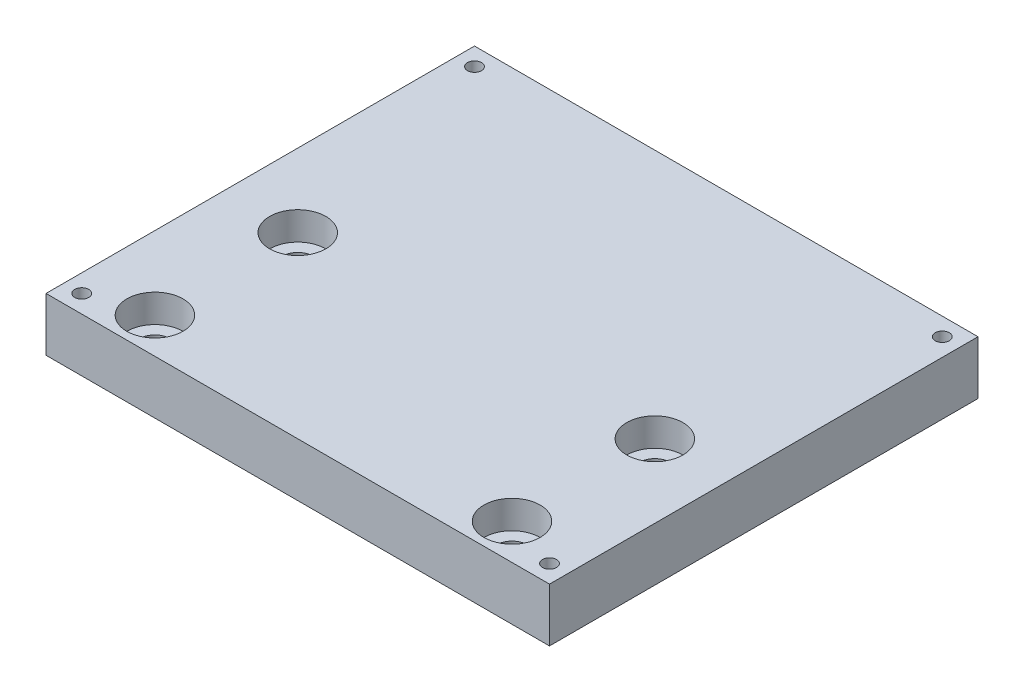
ISO-10303-21;
HEADER;
FILE_DESCRIPTION(('STEP AP214'),'2;1');
FILE_NAME('part.step','',(''),(''),'','','');
FILE_SCHEMA(('AUTOMOTIVE_DESIGN { 1 0 10303 214 1 1 1 1 }'));
ENDSEC;
DATA;
#1=APPLICATION_CONTEXT('core data for automotive mechanical design processes');
#2=APPLICATION_PROTOCOL_DEFINITION('international standard','automotive_design',2000,#1);
#3=PRODUCT_CONTEXT('',#1,'mechanical');
#4=PRODUCT('Part','Part','',(#3));
#5=PRODUCT_RELATED_PRODUCT_CATEGORY('part','',(#4));
#6=PRODUCT_DEFINITION_FORMATION('','',#4);
#7=PRODUCT_DEFINITION_CONTEXT('part definition',#1,'design');
#8=PRODUCT_DEFINITION('design','',#6,#7);
#9=PRODUCT_DEFINITION_SHAPE('','',#8);
#10=(LENGTH_UNIT() NAMED_UNIT(*) SI_UNIT(.MILLI.,.METRE.));
#11=(NAMED_UNIT(*) PLANE_ANGLE_UNIT() SI_UNIT($,.RADIAN.));
#12=(NAMED_UNIT(*) SI_UNIT($,.STERADIAN.) SOLID_ANGLE_UNIT());
#13=UNCERTAINTY_MEASURE_WITH_UNIT(LENGTH_MEASURE(1.E-05),#10,'distance_accuracy_value','');
#14=(GEOMETRIC_REPRESENTATION_CONTEXT(3) GLOBAL_UNCERTAINTY_ASSIGNED_CONTEXT((#13)) GLOBAL_UNIT_ASSIGNED_CONTEXT((#10,
#11,#12)) REPRESENTATION_CONTEXT('',''));
#15=CARTESIAN_POINT('',(0.,0.,0.));
#16=DIRECTION('',(0.,0.,1.));
#17=DIRECTION('',(1.,0.,0.));
#18=AXIS2_PLACEMENT_3D('',#15,#16,#17);
#19=CARTESIAN_POINT('',(44.7675,9.525,38.1));
#20=DIRECTION('',(-1.,0.,0.));
#21=DIRECTION('',(0.,0.,1.));
#22=AXIS2_PLACEMENT_3D('',#19,#20,#21);
#23=PLANE('',#22);
#24=DIRECTION('',(0.,0.,-1.));
#25=VECTOR('',#24,1.);
#26=CARTESIAN_POINT('',(44.7675,0.,38.1));
#27=LINE('',#26,#25);
#28=CARTESIAN_POINT('',(44.7675,0.,38.1));
#29=VERTEX_POINT('',#28);
#30=CARTESIAN_POINT('',(44.7675,0.,-38.1));
#31=VERTEX_POINT('',#30);
#32=EDGE_CURVE('E94',#29,#31,#27,.T.);
#33=ORIENTED_EDGE('',*,*,#32,.T.);
#34=DIRECTION('',(0.,-1.,0.));
#35=VECTOR('',#34,1.);
#36=CARTESIAN_POINT('',(44.7675,9.525,-38.1));
#37=LINE('',#36,#35);
#38=CARTESIAN_POINT('',(44.7675,9.525,-38.1));
#39=VERTEX_POINT('',#38);
#40=EDGE_CURVE('E11',#39,#31,#37,.T.);
#41=ORIENTED_EDGE('',*,*,#40,.F.);
#42=DIRECTION('',(0.,0.,-1.));
#43=VECTOR('',#42,1.);
#44=CARTESIAN_POINT('',(44.7675,9.525,38.1));
#45=LINE('',#44,#43);
#46=CARTESIAN_POINT('',(44.7675,9.525,38.1));
#47=VERTEX_POINT('',#46);
#48=EDGE_CURVE('E82',#47,#39,#45,.T.);
#49=ORIENTED_EDGE('',*,*,#48,.F.);
#50=DIRECTION('',(0.,-1.,0.));
#51=VECTOR('',#50,1.);
#52=CARTESIAN_POINT('',(44.7675,9.525,38.1));
#53=LINE('',#52,#51);
#54=EDGE_CURVE('E90',#47,#29,#53,.T.);
#55=ORIENTED_EDGE('',*,*,#54,.T.);
#56=EDGE_LOOP('',(#33,#41,#49,#55));
#57=FACE_BOUND('',#56,.T.);
#58=ADVANCED_FACE('F31',(#57),#23,.F.);
#59=CARTESIAN_POINT('',(-44.7675,9.525,-38.1));
#60=DIRECTION('',(0.,0.,1.));
#61=DIRECTION('',(1.,0.,0.));
#62=AXIS2_PLACEMENT_3D('',#59,#60,#61);
#63=PLANE('',#62);
#64=DIRECTION('',(-1.,0.,0.));
#65=VECTOR('',#64,1.);
#66=CARTESIAN_POINT('',(-44.7675,0.,-38.1));
#67=LINE('',#66,#65);
#68=CARTESIAN_POINT('',(-44.7675,0.,-38.1));
#69=VERTEX_POINT('',#68);
#70=EDGE_CURVE('E86',#31,#69,#67,.T.);
#71=ORIENTED_EDGE('',*,*,#70,.T.);
#72=DIRECTION('',(0.,-1.,0.));
#73=VECTOR('',#72,1.);
#74=CARTESIAN_POINT('',(-44.7675,9.525,-38.1));
#75=LINE('',#74,#73);
#76=CARTESIAN_POINT('',(-44.7675,9.525,-38.1));
#77=VERTEX_POINT('',#76);
#78=EDGE_CURVE('E39',#77,#69,#75,.T.);
#79=ORIENTED_EDGE('',*,*,#78,.F.);
#80=DIRECTION('',(-1.,0.,0.));
#81=VECTOR('',#80,1.);
#82=CARTESIAN_POINT('',(-44.7675,9.525,-38.1));
#83=LINE('',#82,#81);
#84=EDGE_CURVE('E77',#39,#77,#83,.T.);
#85=ORIENTED_EDGE('',*,*,#84,.F.);
#86=ORIENTED_EDGE('',*,*,#40,.T.);
#87=EDGE_LOOP('',(#71,#79,#85,#86));
#88=FACE_BOUND('',#87,.T.);
#89=ADVANCED_FACE('F85',(#88),#63,.F.);
#90=CARTESIAN_POINT('',(-44.7675,9.525,38.1));
#91=DIRECTION('',(1.,0.,0.));
#92=DIRECTION('',(0.,0.,-1.));
#93=AXIS2_PLACEMENT_3D('',#90,#91,#92);
#94=PLANE('',#93);
#95=DIRECTION('',(0.,0.,1.));
#96=VECTOR('',#95,1.);
#97=CARTESIAN_POINT('',(-44.7675,0.,38.1));
#98=LINE('',#97,#96);
#99=CARTESIAN_POINT('',(-44.7675,0.,38.1));
#100=VERTEX_POINT('',#99);
#101=EDGE_CURVE('E64',#69,#100,#98,.T.);
#102=ORIENTED_EDGE('',*,*,#101,.T.);
#103=DIRECTION('',(0.,-1.,0.));
#104=VECTOR('',#103,1.);
#105=CARTESIAN_POINT('',(-44.7675,9.525,38.1));
#106=LINE('',#105,#104);
#107=CARTESIAN_POINT('',(-44.7675,9.525,38.1));
#108=VERTEX_POINT('',#107);
#109=EDGE_CURVE('E87',#108,#100,#106,.T.);
#110=ORIENTED_EDGE('',*,*,#109,.F.);
#111=DIRECTION('',(0.,0.,1.));
#112=VECTOR('',#111,1.);
#113=CARTESIAN_POINT('',(-44.7675,9.525,38.1));
#114=LINE('',#113,#112);
#115=EDGE_CURVE('E80',#77,#108,#114,.T.);
#116=ORIENTED_EDGE('',*,*,#115,.F.);
#117=ORIENTED_EDGE('',*,*,#78,.T.);
#118=EDGE_LOOP('',(#102,#110,#116,#117));
#119=FACE_BOUND('',#118,.T.);
#120=ADVANCED_FACE('F88',(#119),#94,.F.);
#121=CARTESIAN_POINT('',(-44.7675,9.525,38.1));
#122=DIRECTION('',(0.,0.,-1.));
#123=DIRECTION('',(-1.,0.,0.));
#124=AXIS2_PLACEMENT_3D('',#121,#122,#123);
#125=PLANE('',#124);
#126=DIRECTION('',(1.,0.,0.));
#127=VECTOR('',#126,1.);
#128=CARTESIAN_POINT('',(-44.7675,0.,38.1));
#129=LINE('',#128,#127);
#130=EDGE_CURVE('E70',#100,#29,#129,.T.);
#131=ORIENTED_EDGE('',*,*,#130,.T.);
#132=ORIENTED_EDGE('',*,*,#54,.F.);
#133=DIRECTION('',(1.,0.,0.));
#134=VECTOR('',#133,1.);
#135=CARTESIAN_POINT('',(-44.7675,9.525,38.1));
#136=LINE('',#135,#134);
#137=EDGE_CURVE('E47',#108,#47,#136,.T.);
#138=ORIENTED_EDGE('',*,*,#137,.F.);
#139=ORIENTED_EDGE('',*,*,#109,.T.);
#140=EDGE_LOOP('',(#131,#132,#138,#139));
#141=FACE_BOUND('',#140,.T.);
#142=ADVANCED_FACE('F102',(#141),#125,.F.);
#143=CARTESIAN_POINT('',(44.7675,9.525,-38.1));
#144=DIRECTION('',(0.,-1.,0.));
#145=DIRECTION('',(0.,0.,-1.));
#146=AXIS2_PLACEMENT_3D('',#143,#144,#145);
#147=PLANE('',#146);
#148=CARTESIAN_POINT('',(41.5925,9.525,-34.925));
#149=DIRECTION('',(0.,1.,0.));
#150=DIRECTION('',(0.,0.,1.));
#151=AXIS2_PLACEMENT_3D('',#148,#149,#150);
#152=CIRCLE('',#151,1.24999999999999);
#153=CARTESIAN_POINT('',(41.5925,9.525,-33.675));
#154=VERTEX_POINT('',#153);
#155=EDGE_CURVE('E176',#154,#154,#152,.T.);
#156=ORIENTED_EDGE('',*,*,#155,.F.);
#157=EDGE_LOOP('',(#156));
#158=FACE_BOUND('',#157,.T.);
#159=CARTESIAN_POINT('',(41.5925,9.525,34.925));
#160=DIRECTION('',(0.,1.,0.));
#161=DIRECTION('',(0.,0.,1.));
#162=AXIS2_PLACEMENT_3D('',#159,#160,#161);
#163=CIRCLE('',#162,1.24999999999999);
#164=CARTESIAN_POINT('',(41.5925,9.525,36.175));
#165=VERTEX_POINT('',#164);
#166=EDGE_CURVE('E170',#165,#165,#163,.T.);
#167=ORIENTED_EDGE('',*,*,#166,.F.);
#168=EDGE_LOOP('',(#167));
#169=FACE_BOUND('',#168,.T.);
#170=CARTESIAN_POINT('',(-41.5925,9.525,-34.925));
#171=DIRECTION('',(0.,1.,0.));
#172=DIRECTION('',(0.,0.,1.));
#173=AXIS2_PLACEMENT_3D('',#170,#171,#172);
#174=CIRCLE('',#173,1.24999999999999);
#175=CARTESIAN_POINT('',(-41.5925,9.525,-33.675));
#176=VERTEX_POINT('',#175);
#177=EDGE_CURVE('E164',#176,#176,#174,.T.);
#178=ORIENTED_EDGE('',*,*,#177,.F.);
#179=EDGE_LOOP('',(#178));
#180=FACE_BOUND('',#179,.T.);
#181=CARTESIAN_POINT('',(-41.5925,9.525,34.925));
#182=DIRECTION('',(0.,1.,0.));
#183=DIRECTION('',(0.,0.,1.));
#184=AXIS2_PLACEMENT_3D('',#181,#182,#183);
#185=CIRCLE('',#184,1.24999999999999);
#186=CARTESIAN_POINT('',(-41.5925,9.525,36.175));
#187=VERTEX_POINT('',#186);
#188=EDGE_CURVE('E158',#187,#187,#185,.T.);
#189=ORIENTED_EDGE('',*,*,#188,.F.);
#190=EDGE_LOOP('',(#189));
#191=FACE_BOUND('',#190,.T.);
#192=CARTESIAN_POINT('',(31.75,9.525,6.35000000000001));
#193=DIRECTION('',(0.,1.,0.));
#194=DIRECTION('',(0.,0.,1.));
#195=AXIS2_PLACEMENT_3D('',#192,#193,#194);
#196=CIRCLE('',#195,4.99999999999999);
#197=CARTESIAN_POINT('',(31.75,9.525,11.35));
#198=VERTEX_POINT('',#197);
#199=EDGE_CURVE('E152',#198,#198,#196,.T.);
#200=ORIENTED_EDGE('',*,*,#199,.F.);
#201=EDGE_LOOP('',(#200));
#202=FACE_BOUND('',#201,.T.);
#203=CARTESIAN_POINT('',(31.75,9.525,31.75));
#204=DIRECTION('',(0.,1.,0.));
#205=DIRECTION('',(0.,0.,1.));
#206=AXIS2_PLACEMENT_3D('',#203,#204,#205);
#207=CIRCLE('',#206,4.99999999999999);
#208=CARTESIAN_POINT('',(31.75,9.525,36.75));
#209=VERTEX_POINT('',#208);
#210=EDGE_CURVE('E140',#209,#209,#207,.T.);
#211=ORIENTED_EDGE('',*,*,#210,.F.);
#212=EDGE_LOOP('',(#211));
#213=FACE_BOUND('',#212,.T.);
#214=CARTESIAN_POINT('',(-31.75,9.525,6.35000000000001));
#215=DIRECTION('',(0.,1.,0.));
#216=DIRECTION('',(0.,0.,1.));
#217=AXIS2_PLACEMENT_3D('',#214,#215,#216);
#218=CIRCLE('',#217,4.99999999999999);
#219=CARTESIAN_POINT('',(-31.75,9.525,11.35));
#220=VERTEX_POINT('',#219);
#221=EDGE_CURVE('E128',#220,#220,#218,.T.);
#222=ORIENTED_EDGE('',*,*,#221,.F.);
#223=EDGE_LOOP('',(#222));
#224=FACE_BOUND('',#223,.T.);
#225=CARTESIAN_POINT('',(-31.75,9.525,31.75));
#226=DIRECTION('',(0.,1.,0.));
#227=DIRECTION('',(0.,0.,1.));
#228=AXIS2_PLACEMENT_3D('',#225,#226,#227);
#229=CIRCLE('',#228,4.99999999999999);
#230=CARTESIAN_POINT('',(-31.75,9.525,36.75));
#231=VERTEX_POINT('',#230);
#232=EDGE_CURVE('E116',#231,#231,#229,.T.);
#233=ORIENTED_EDGE('',*,*,#232,.F.);
#234=EDGE_LOOP('',(#233));
#235=FACE_BOUND('',#234,.T.);
#236=ORIENTED_EDGE('',*,*,#48,.T.);
#237=ORIENTED_EDGE('',*,*,#84,.T.);
#238=ORIENTED_EDGE('',*,*,#115,.T.);
#239=ORIENTED_EDGE('',*,*,#137,.T.);
#240=EDGE_LOOP('',(#236,#237,#238,#239));
#241=FACE_BOUND('',#240,.T.);
#242=ADVANCED_FACE('F78',(#158,#169,#180,#191,#202,#213,#224,#235,#241),#147,.F.);
#243=CARTESIAN_POINT('',(44.7675,0.,-38.1));
#244=DIRECTION('',(0.,-1.,0.));
#245=DIRECTION('',(0.,0.,-1.));
#246=AXIS2_PLACEMENT_3D('',#243,#244,#245);
#247=PLANE('',#246);
#248=CARTESIAN_POINT('',(41.5925,0.,-34.925));
#249=DIRECTION('',(0.,1.,0.));
#250=DIRECTION('',(0.,0.,1.));
#251=AXIS2_PLACEMENT_3D('',#248,#249,#250);
#252=CIRCLE('',#251,1.25);
#253=CARTESIAN_POINT('',(41.5925,0.,-33.675));
#254=VERTEX_POINT('',#253);
#255=EDGE_CURVE('E173',#254,#254,#252,.T.);
#256=ORIENTED_EDGE('',*,*,#255,.T.);
#257=EDGE_LOOP('',(#256));
#258=FACE_BOUND('',#257,.T.);
#259=CARTESIAN_POINT('',(41.5925,0.,34.925));
#260=DIRECTION('',(0.,1.,0.));
#261=DIRECTION('',(0.,0.,1.));
#262=AXIS2_PLACEMENT_3D('',#259,#260,#261);
#263=CIRCLE('',#262,1.25);
#264=CARTESIAN_POINT('',(41.5925,0.,36.175));
#265=VERTEX_POINT('',#264);
#266=EDGE_CURVE('E167',#265,#265,#263,.T.);
#267=ORIENTED_EDGE('',*,*,#266,.T.);
#268=EDGE_LOOP('',(#267));
#269=FACE_BOUND('',#268,.T.);
#270=CARTESIAN_POINT('',(-41.5925,0.,-34.925));
#271=DIRECTION('',(0.,1.,0.));
#272=DIRECTION('',(0.,0.,1.));
#273=AXIS2_PLACEMENT_3D('',#270,#271,#272);
#274=CIRCLE('',#273,1.25);
#275=CARTESIAN_POINT('',(-41.5925,0.,-33.675));
#276=VERTEX_POINT('',#275);
#277=EDGE_CURVE('E161',#276,#276,#274,.T.);
#278=ORIENTED_EDGE('',*,*,#277,.T.);
#279=EDGE_LOOP('',(#278));
#280=FACE_BOUND('',#279,.T.);
#281=CARTESIAN_POINT('',(-41.5925,0.,34.925));
#282=DIRECTION('',(0.,1.,0.));
#283=DIRECTION('',(0.,0.,1.));
#284=AXIS2_PLACEMENT_3D('',#281,#282,#283);
#285=CIRCLE('',#284,1.25);
#286=CARTESIAN_POINT('',(-41.5925,0.,36.175));
#287=VERTEX_POINT('',#286);
#288=EDGE_CURVE('E155',#287,#287,#285,.T.);
#289=ORIENTED_EDGE('',*,*,#288,.T.);
#290=EDGE_LOOP('',(#289));
#291=FACE_BOUND('',#290,.T.);
#292=CARTESIAN_POINT('',(31.75,0.,6.35000000000001));
#293=DIRECTION('',(0.,1.,0.));
#294=DIRECTION('',(0.,0.,1.));
#295=AXIS2_PLACEMENT_3D('',#292,#293,#294);
#296=CIRCLE('',#295,2.75);
#297=CARTESIAN_POINT('',(31.75,0.,9.1));
#298=VERTEX_POINT('',#297);
#299=EDGE_CURVE('E143',#298,#298,#296,.T.);
#300=ORIENTED_EDGE('',*,*,#299,.T.);
#301=EDGE_LOOP('',(#300));
#302=FACE_BOUND('',#301,.T.);
#303=CARTESIAN_POINT('',(31.75,0.,31.75));
#304=DIRECTION('',(0.,1.,0.));
#305=DIRECTION('',(0.,0.,1.));
#306=AXIS2_PLACEMENT_3D('',#303,#304,#305);
#307=CIRCLE('',#306,2.75);
#308=CARTESIAN_POINT('',(31.75,0.,34.5));
#309=VERTEX_POINT('',#308);
#310=EDGE_CURVE('E131',#309,#309,#307,.T.);
#311=ORIENTED_EDGE('',*,*,#310,.T.);
#312=EDGE_LOOP('',(#311));
#313=FACE_BOUND('',#312,.T.);
#314=CARTESIAN_POINT('',(-31.75,0.,6.35000000000001));
#315=DIRECTION('',(0.,1.,0.));
#316=DIRECTION('',(0.,0.,1.));
#317=AXIS2_PLACEMENT_3D('',#314,#315,#316);
#318=CIRCLE('',#317,2.75);
#319=CARTESIAN_POINT('',(-31.75,0.,9.10000000000001));
#320=VERTEX_POINT('',#319);
#321=EDGE_CURVE('E119',#320,#320,#318,.T.);
#322=ORIENTED_EDGE('',*,*,#321,.T.);
#323=EDGE_LOOP('',(#322));
#324=FACE_BOUND('',#323,.T.);
#325=CARTESIAN_POINT('',(-31.75,0.,31.75));
#326=DIRECTION('',(0.,1.,0.));
#327=DIRECTION('',(0.,0.,1.));
#328=AXIS2_PLACEMENT_3D('',#325,#326,#327);
#329=CIRCLE('',#328,2.75);
#330=CARTESIAN_POINT('',(-31.75,0.,34.5));
#331=VERTEX_POINT('',#330);
#332=EDGE_CURVE('E97',#331,#331,#329,.T.);
#333=ORIENTED_EDGE('',*,*,#332,.T.);
#334=EDGE_LOOP('',(#333));
#335=FACE_BOUND('',#334,.T.);
#336=ORIENTED_EDGE('',*,*,#32,.F.);
#337=ORIENTED_EDGE('',*,*,#130,.F.);
#338=ORIENTED_EDGE('',*,*,#101,.F.);
#339=ORIENTED_EDGE('',*,*,#70,.F.);
#340=EDGE_LOOP('',(#336,#337,#338,#339));
#341=FACE_BOUND('',#340,.T.);
#342=ADVANCED_FACE('F105',(#258,#269,#280,#291,#302,#313,#324,#335,#341),#247,.T.);
#343=CARTESIAN_POINT('',(-31.75,9.525,31.75));
#344=DIRECTION('',(0.,1.,0.));
#345=DIRECTION('',(0.,0.,1.));
#346=AXIS2_PLACEMENT_3D('',#343,#344,#345);
#347=CYLINDRICAL_SURFACE('',#346,2.75);
#348=ORIENTED_EDGE('',*,*,#332,.F.);
#349=EDGE_LOOP('',(#348));
#350=FACE_BOUND('',#349,.T.);
#351=CARTESIAN_POINT('',(-31.75,4.525,31.75));
#352=DIRECTION('',(0.,1.,0.));
#353=DIRECTION('',(0.,0.,1.));
#354=AXIS2_PLACEMENT_3D('',#351,#352,#353);
#355=CIRCLE('',#354,2.75000000000001);
#356=CARTESIAN_POINT('',(-31.75,4.525,34.5));
#357=VERTEX_POINT('',#356);
#358=EDGE_CURVE('E110',#357,#357,#355,.T.);
#359=ORIENTED_EDGE('',*,*,#358,.T.);
#360=EDGE_LOOP('',(#359));
#361=FACE_BOUND('',#360,.T.);
#362=ADVANCED_FACE('F212',(#350,#361),#347,.F.);
#363=CARTESIAN_POINT('',(-29.,4.525,31.75));
#364=DIRECTION('',(0.,-1.,0.));
#365=DIRECTION('',(0.,0.,-1.));
#366=AXIS2_PLACEMENT_3D('',#363,#364,#365);
#367=PLANE('',#366);
#368=ORIENTED_EDGE('',*,*,#358,.F.);
#369=EDGE_LOOP('',(#368));
#370=FACE_BOUND('',#369,.T.);
#371=CARTESIAN_POINT('',(-31.75,4.525,31.75));
#372=DIRECTION('',(0.,1.,0.));
#373=DIRECTION('',(0.,0.,1.));
#374=AXIS2_PLACEMENT_3D('',#371,#372,#373);
#375=CIRCLE('',#374,4.99999999999999);
#376=CARTESIAN_POINT('',(-31.75,4.525,36.75));
#377=VERTEX_POINT('',#376);
#378=EDGE_CURVE('E113',#377,#377,#375,.T.);
#379=ORIENTED_EDGE('',*,*,#378,.T.);
#380=EDGE_LOOP('',(#379));
#381=FACE_BOUND('',#380,.T.);
#382=ADVANCED_FACE('F202',(#370,#381),#367,.F.);
#383=CARTESIAN_POINT('',(-31.75,9.525,31.75));
#384=DIRECTION('',(0.,1.,0.));
#385=DIRECTION('',(0.,0.,1.));
#386=AXIS2_PLACEMENT_3D('',#383,#384,#385);
#387=CYLINDRICAL_SURFACE('',#386,4.99999999999999);
#388=ORIENTED_EDGE('',*,*,#378,.F.);
#389=EDGE_LOOP('',(#388));
#390=FACE_BOUND('',#389,.T.);
#391=ORIENTED_EDGE('',*,*,#232,.T.);
#392=EDGE_LOOP('',(#391));
#393=FACE_BOUND('',#392,.T.);
#394=ADVANCED_FACE('F199',(#390,#393),#387,.F.);
#395=CARTESIAN_POINT('',(-31.75,9.525,6.35000000000001));
#396=DIRECTION('',(0.,1.,0.));
#397=DIRECTION('',(0.,0.,1.));
#398=AXIS2_PLACEMENT_3D('',#395,#396,#397);
#399=CYLINDRICAL_SURFACE('',#398,2.75);
#400=ORIENTED_EDGE('',*,*,#321,.F.);
#401=EDGE_LOOP('',(#400));
#402=FACE_BOUND('',#401,.T.);
#403=CARTESIAN_POINT('',(-31.75,4.525,6.35000000000001));
#404=DIRECTION('',(0.,1.,0.));
#405=DIRECTION('',(0.,0.,1.));
#406=AXIS2_PLACEMENT_3D('',#403,#404,#405);
#407=CIRCLE('',#406,2.75000000000001);
#408=CARTESIAN_POINT('',(-31.75,4.525,9.10000000000002));
#409=VERTEX_POINT('',#408);
#410=EDGE_CURVE('E122',#409,#409,#407,.T.);
#411=ORIENTED_EDGE('',*,*,#410,.T.);
#412=EDGE_LOOP('',(#411));
#413=FACE_BOUND('',#412,.T.);
#414=ADVANCED_FACE('F201',(#402,#413),#399,.F.);
#415=CARTESIAN_POINT('',(-29.,4.525,6.35000000000001));
#416=DIRECTION('',(0.,-1.,0.));
#417=DIRECTION('',(0.,0.,-1.));
#418=AXIS2_PLACEMENT_3D('',#415,#416,#417);
#419=PLANE('',#418);
#420=ORIENTED_EDGE('',*,*,#410,.F.);
#421=EDGE_LOOP('',(#420));
#422=FACE_BOUND('',#421,.T.);
#423=CARTESIAN_POINT('',(-31.75,4.525,6.35000000000001));
#424=DIRECTION('',(0.,1.,0.));
#425=DIRECTION('',(0.,0.,1.));
#426=AXIS2_PLACEMENT_3D('',#423,#424,#425);
#427=CIRCLE('',#426,4.99999999999999);
#428=CARTESIAN_POINT('',(-31.75,4.525,11.35));
#429=VERTEX_POINT('',#428);
#430=EDGE_CURVE('E125',#429,#429,#427,.T.);
#431=ORIENTED_EDGE('',*,*,#430,.T.);
#432=EDGE_LOOP('',(#431));
#433=FACE_BOUND('',#432,.T.);
#434=ADVANCED_FACE('F209',(#422,#433),#419,.F.);
#435=CARTESIAN_POINT('',(-31.75,9.525,6.35000000000001));
#436=DIRECTION('',(0.,1.,0.));
#437=DIRECTION('',(0.,0.,1.));
#438=AXIS2_PLACEMENT_3D('',#435,#436,#437);
#439=CYLINDRICAL_SURFACE('',#438,4.99999999999999);
#440=ORIENTED_EDGE('',*,*,#430,.F.);
#441=EDGE_LOOP('',(#440));
#442=FACE_BOUND('',#441,.T.);
#443=ORIENTED_EDGE('',*,*,#221,.T.);
#444=EDGE_LOOP('',(#443));
#445=FACE_BOUND('',#444,.T.);
#446=ADVANCED_FACE('F267',(#442,#445),#439,.F.);
#447=CARTESIAN_POINT('',(31.75,9.525,31.75));
#448=DIRECTION('',(0.,1.,0.));
#449=DIRECTION('',(0.,0.,1.));
#450=AXIS2_PLACEMENT_3D('',#447,#448,#449);
#451=CYLINDRICAL_SURFACE('',#450,2.75);
#452=ORIENTED_EDGE('',*,*,#310,.F.);
#453=EDGE_LOOP('',(#452));
#454=FACE_BOUND('',#453,.T.);
#455=CARTESIAN_POINT('',(31.75,4.525,31.75));
#456=DIRECTION('',(0.,1.,0.));
#457=DIRECTION('',(0.,0.,1.));
#458=AXIS2_PLACEMENT_3D('',#455,#456,#457);
#459=CIRCLE('',#458,2.75000000000001);
#460=CARTESIAN_POINT('',(31.75,4.525,34.5));
#461=VERTEX_POINT('',#460);
#462=EDGE_CURVE('E134',#461,#461,#459,.T.);
#463=ORIENTED_EDGE('',*,*,#462,.T.);
#464=EDGE_LOOP('',(#463));
#465=FACE_BOUND('',#464,.T.);
#466=ADVANCED_FACE('F277',(#454,#465),#451,.F.);
#467=CARTESIAN_POINT('',(34.5,4.525,31.75));
#468=DIRECTION('',(0.,-1.,0.));
#469=DIRECTION('',(0.,0.,-1.));
#470=AXIS2_PLACEMENT_3D('',#467,#468,#469);
#471=PLANE('',#470);
#472=ORIENTED_EDGE('',*,*,#462,.F.);
#473=EDGE_LOOP('',(#472));
#474=FACE_BOUND('',#473,.T.);
#475=CARTESIAN_POINT('',(31.75,4.525,31.75));
#476=DIRECTION('',(0.,1.,0.));
#477=DIRECTION('',(0.,0.,1.));
#478=AXIS2_PLACEMENT_3D('',#475,#476,#477);
#479=CIRCLE('',#478,4.99999999999999);
#480=CARTESIAN_POINT('',(31.75,4.525,36.75));
#481=VERTEX_POINT('',#480);
#482=EDGE_CURVE('E137',#481,#481,#479,.T.);
#483=ORIENTED_EDGE('',*,*,#482,.T.);
#484=EDGE_LOOP('',(#483));
#485=FACE_BOUND('',#484,.T.);
#486=ADVANCED_FACE('F287',(#474,#485),#471,.F.);
#487=CARTESIAN_POINT('',(31.75,9.525,31.75));
#488=DIRECTION('',(0.,1.,0.));
#489=DIRECTION('',(0.,0.,1.));
#490=AXIS2_PLACEMENT_3D('',#487,#488,#489);
#491=CYLINDRICAL_SURFACE('',#490,4.99999999999999);
#492=ORIENTED_EDGE('',*,*,#482,.F.);
#493=EDGE_LOOP('',(#492));
#494=FACE_BOUND('',#493,.T.);
#495=ORIENTED_EDGE('',*,*,#210,.T.);
#496=EDGE_LOOP('',(#495));
#497=FACE_BOUND('',#496,.T.);
#498=ADVANCED_FACE('F297',(#494,#497),#491,.F.);
#499=CARTESIAN_POINT('',(31.75,9.525,6.35000000000001));
#500=DIRECTION('',(0.,1.,0.));
#501=DIRECTION('',(0.,0.,1.));
#502=AXIS2_PLACEMENT_3D('',#499,#500,#501);
#503=CYLINDRICAL_SURFACE('',#502,2.75);
#504=ORIENTED_EDGE('',*,*,#299,.F.);
#505=EDGE_LOOP('',(#504));
#506=FACE_BOUND('',#505,.T.);
#507=CARTESIAN_POINT('',(31.75,4.525,6.35000000000001));
#508=DIRECTION('',(0.,1.,0.));
#509=DIRECTION('',(0.,0.,1.));
#510=AXIS2_PLACEMENT_3D('',#507,#508,#509);
#511=CIRCLE('',#510,2.75000000000001);
#512=CARTESIAN_POINT('',(31.75,4.525,9.10000000000002));
#513=VERTEX_POINT('',#512);
#514=EDGE_CURVE('E146',#513,#513,#511,.T.);
#515=ORIENTED_EDGE('',*,*,#514,.T.);
#516=EDGE_LOOP('',(#515));
#517=FACE_BOUND('',#516,.T.);
#518=ADVANCED_FACE('F307',(#506,#517),#503,.F.);
#519=CARTESIAN_POINT('',(34.5,4.525,6.35000000000001));
#520=DIRECTION('',(0.,-1.,0.));
#521=DIRECTION('',(0.,0.,-1.));
#522=AXIS2_PLACEMENT_3D('',#519,#520,#521);
#523=PLANE('',#522);
#524=ORIENTED_EDGE('',*,*,#514,.F.);
#525=EDGE_LOOP('',(#524));
#526=FACE_BOUND('',#525,.T.);
#527=CARTESIAN_POINT('',(31.75,4.525,6.35000000000001));
#528=DIRECTION('',(0.,1.,0.));
#529=DIRECTION('',(0.,0.,1.));
#530=AXIS2_PLACEMENT_3D('',#527,#528,#529);
#531=CIRCLE('',#530,4.99999999999999);
#532=CARTESIAN_POINT('',(31.75,4.525,11.35));
#533=VERTEX_POINT('',#532);
#534=EDGE_CURVE('E149',#533,#533,#531,.T.);
#535=ORIENTED_EDGE('',*,*,#534,.T.);
#536=EDGE_LOOP('',(#535));
#537=FACE_BOUND('',#536,.T.);
#538=ADVANCED_FACE('F317',(#526,#537),#523,.F.);
#539=CARTESIAN_POINT('',(31.75,9.525,6.35000000000001));
#540=DIRECTION('',(0.,1.,0.));
#541=DIRECTION('',(0.,0.,1.));
#542=AXIS2_PLACEMENT_3D('',#539,#540,#541);
#543=CYLINDRICAL_SURFACE('',#542,4.99999999999999);
#544=ORIENTED_EDGE('',*,*,#534,.F.);
#545=EDGE_LOOP('',(#544));
#546=FACE_BOUND('',#545,.T.);
#547=ORIENTED_EDGE('',*,*,#199,.T.);
#548=EDGE_LOOP('',(#547));
#549=FACE_BOUND('',#548,.T.);
#550=ADVANCED_FACE('F327',(#546,#549),#543,.F.);
#551=CARTESIAN_POINT('',(-41.5925,9.525,34.925));
#552=DIRECTION('',(0.,1.,0.));
#553=DIRECTION('',(0.,0.,1.));
#554=AXIS2_PLACEMENT_3D('',#551,#552,#553);
#555=CYLINDRICAL_SURFACE('',#554,1.24999999999999);
#556=ORIENTED_EDGE('',*,*,#288,.F.);
#557=EDGE_LOOP('',(#556));
#558=FACE_BOUND('',#557,.T.);
#559=ORIENTED_EDGE('',*,*,#188,.T.);
#560=EDGE_LOOP('',(#559));
#561=FACE_BOUND('',#560,.T.);
#562=ADVANCED_FACE('F337',(#558,#561),#555,.F.);
#563=CARTESIAN_POINT('',(-41.5925,9.525,-34.925));
#564=DIRECTION('',(0.,1.,0.));
#565=DIRECTION('',(0.,0.,1.));
#566=AXIS2_PLACEMENT_3D('',#563,#564,#565);
#567=CYLINDRICAL_SURFACE('',#566,1.24999999999999);
#568=ORIENTED_EDGE('',*,*,#277,.F.);
#569=EDGE_LOOP('',(#568));
#570=FACE_BOUND('',#569,.T.);
#571=ORIENTED_EDGE('',*,*,#177,.T.);
#572=EDGE_LOOP('',(#571));
#573=FACE_BOUND('',#572,.T.);
#574=ADVANCED_FACE('F346',(#570,#573),#567,.F.);
#575=CARTESIAN_POINT('',(41.5925,9.525,34.925));
#576=DIRECTION('',(0.,1.,0.));
#577=DIRECTION('',(0.,0.,1.));
#578=AXIS2_PLACEMENT_3D('',#575,#576,#577);
#579=CYLINDRICAL_SURFACE('',#578,1.24999999999999);
#580=ORIENTED_EDGE('',*,*,#266,.F.);
#581=EDGE_LOOP('',(#580));
#582=FACE_BOUND('',#581,.T.);
#583=ORIENTED_EDGE('',*,*,#166,.T.);
#584=EDGE_LOOP('',(#583));
#585=FACE_BOUND('',#584,.T.);
#586=ADVANCED_FACE('F361',(#582,#585),#579,.F.);
#587=CARTESIAN_POINT('',(41.5925,9.525,-34.925));
#588=DIRECTION('',(0.,1.,0.));
#589=DIRECTION('',(0.,0.,1.));
#590=AXIS2_PLACEMENT_3D('',#587,#588,#589);
#591=CYLINDRICAL_SURFACE('',#590,1.24999999999999);
#592=ORIENTED_EDGE('',*,*,#255,.F.);
#593=EDGE_LOOP('',(#592));
#594=FACE_BOUND('',#593,.T.);
#595=ORIENTED_EDGE('',*,*,#155,.T.);
#596=EDGE_LOOP('',(#595));
#597=FACE_BOUND('',#596,.T.);
#598=ADVANCED_FACE('F180',(#594,#597),#591,.F.);
#599=CLOSED_SHELL('',(#58,#89,#120,#142,#242,#342,#362,#382,#394,#414,#434,#446,#466,#486,#498,
#518,#538,#550,#562,#574,#586,#598));
#600=MANIFOLD_SOLID_BREP('B2',#599);
#601=ADVANCED_BREP_SHAPE_REPRESENTATION('',(#18,#600),#14);
#602=SHAPE_DEFINITION_REPRESENTATION(#9,#601);
ENDSEC;
END-ISO-10303-21;
